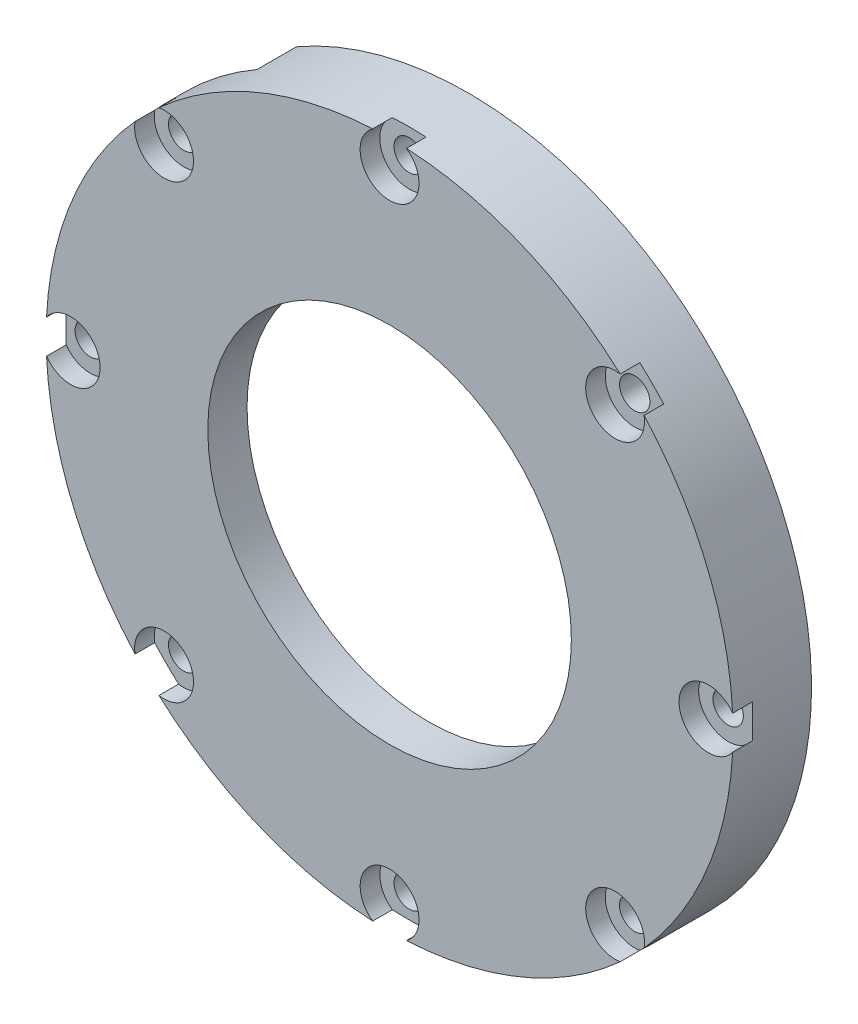
ISO-10303-21;
HEADER;
FILE_DESCRIPTION(('STEP AP214'),'2;1');
FILE_NAME('part.step','',(''),(''),'','','');
FILE_SCHEMA(('AUTOMOTIVE_DESIGN { 1 0 10303 214 1 1 1 1 }'));
ENDSEC;
DATA;
#1=APPLICATION_CONTEXT('core data for automotive mechanical design processes');
#2=APPLICATION_PROTOCOL_DEFINITION('international standard','automotive_design',2000,#1);
#3=PRODUCT_CONTEXT('',#1,'mechanical');
#4=PRODUCT('Part','Part','',(#3));
#5=PRODUCT_RELATED_PRODUCT_CATEGORY('part','',(#4));
#6=PRODUCT_DEFINITION_FORMATION('','',#4);
#7=PRODUCT_DEFINITION_CONTEXT('part definition',#1,'design');
#8=PRODUCT_DEFINITION('design','',#6,#7);
#9=PRODUCT_DEFINITION_SHAPE('','',#8);
#10=(LENGTH_UNIT() NAMED_UNIT(*) SI_UNIT(.MILLI.,.METRE.));
#11=(NAMED_UNIT(*) PLANE_ANGLE_UNIT() SI_UNIT($,.RADIAN.));
#12=(NAMED_UNIT(*) SI_UNIT($,.STERADIAN.) SOLID_ANGLE_UNIT());
#13=UNCERTAINTY_MEASURE_WITH_UNIT(LENGTH_MEASURE(1.E-05),#10,'distance_accuracy_value','');
#14=(GEOMETRIC_REPRESENTATION_CONTEXT(3) GLOBAL_UNCERTAINTY_ASSIGNED_CONTEXT((#13)) GLOBAL_UNIT_ASSIGNED_CONTEXT((#10,
#11,#12)) REPRESENTATION_CONTEXT('',''));
#15=CARTESIAN_POINT('',(0.,0.,0.));
#16=DIRECTION('',(0.,0.,1.));
#17=DIRECTION('',(1.,0.,0.));
#18=AXIS2_PLACEMENT_3D('',#15,#16,#17);
#19=CARTESIAN_POINT('',(-22.9809703885615,-22.9809703885641,2.));
#20=DIRECTION('',(0.,0.,1.));
#21=DIRECTION('',(1.,0.,0.));
#22=AXIS2_PLACEMENT_3D('',#19,#20,#21);
#23=CYLINDRICAL_SURFACE('',#22,1.55000000000094);
#24=CARTESIAN_POINT('',(-22.9809703885615,-22.9809703885641,2.));
#25=DIRECTION('',(0.,0.,1.));
#26=DIRECTION('',(1.,0.,0.));
#27=AXIS2_PLACEMENT_3D('',#24,#25,#26);
#28=CIRCLE('',#27,1.55000000000094);
#29=CARTESIAN_POINT('',(-21.4309703885606,-22.9809703885641,2.));
#30=VERTEX_POINT('',#29);
#31=EDGE_CURVE('E384',#30,#30,#28,.T.);
#32=ORIENTED_EDGE('',*,*,#31,.F.);
#33=EDGE_LOOP('',(#32));
#34=FACE_BOUND('',#33,.T.);
#35=CARTESIAN_POINT('',(-22.9809703885615,-22.9809703885641,8.));
#36=DIRECTION('',(0.,0.,1.));
#37=DIRECTION('',(1.,0.,0.));
#38=AXIS2_PLACEMENT_3D('',#35,#36,#37);
#39=CIRCLE('',#38,1.55000000000094);
#40=CARTESIAN_POINT('',(-21.4309703885606,-22.9809703885641,8.));
#41=VERTEX_POINT('',#40);
#42=EDGE_CURVE('E49',#41,#41,#39,.F.);
#43=ORIENTED_EDGE('',*,*,#42,.F.);
#44=EDGE_LOOP('',(#43));
#45=FACE_BOUND('',#44,.T.);
#46=ADVANCED_FACE('F45',(#34,#45),#23,.F.);
#47=CARTESIAN_POINT('',(22.9809703885641,-22.9809703885628,2.));
#48=DIRECTION('',(0.,0.,1.));
#49=DIRECTION('',(1.,0.,0.));
#50=AXIS2_PLACEMENT_3D('',#47,#48,#49);
#51=CYLINDRICAL_SURFACE('',#50,1.54999999999968);
#52=CARTESIAN_POINT('',(22.9809703885641,-22.9809703885628,2.));
#53=DIRECTION('',(0.,0.,1.));
#54=DIRECTION('',(1.,0.,0.));
#55=AXIS2_PLACEMENT_3D('',#52,#53,#54);
#56=CIRCLE('',#55,1.54999999999968);
#57=CARTESIAN_POINT('',(24.5309703885638,-22.9809703885628,2.));
#58=VERTEX_POINT('',#57);
#59=EDGE_CURVE('E380',#58,#58,#56,.T.);
#60=ORIENTED_EDGE('',*,*,#59,.F.);
#61=EDGE_LOOP('',(#60));
#62=FACE_BOUND('',#61,.T.);
#63=CARTESIAN_POINT('',(22.9809703885641,-22.9809703885628,8.));
#64=DIRECTION('',(0.,0.,1.));
#65=DIRECTION('',(1.,0.,0.));
#66=AXIS2_PLACEMENT_3D('',#63,#64,#65);
#67=CIRCLE('',#66,1.54999999999968);
#68=CARTESIAN_POINT('',(24.5309703885638,-22.9809703885628,8.));
#69=VERTEX_POINT('',#68);
#70=EDGE_CURVE('E416',#69,#69,#67,.F.);
#71=ORIENTED_EDGE('',*,*,#70,.F.);
#72=EDGE_LOOP('',(#71));
#73=FACE_BOUND('',#72,.T.);
#74=ADVANCED_FACE('F471',(#62,#73),#51,.F.);
#75=CARTESIAN_POINT('',(22.9809703885628,22.9809703885628,2.));
#76=DIRECTION('',(0.,0.,1.));
#77=DIRECTION('',(1.,0.,0.));
#78=AXIS2_PLACEMENT_3D('',#75,#76,#77);
#79=CYLINDRICAL_SURFACE('',#78,1.55);
#80=CARTESIAN_POINT('',(22.9809703885628,22.9809703885628,2.));
#81=DIRECTION('',(0.,0.,1.));
#82=DIRECTION('',(1.,0.,0.));
#83=AXIS2_PLACEMENT_3D('',#80,#81,#82);
#84=CIRCLE('',#83,1.55);
#85=CARTESIAN_POINT('',(24.5309703885628,22.9809703885628,2.));
#86=VERTEX_POINT('',#85);
#87=EDGE_CURVE('E208',#86,#86,#84,.T.);
#88=ORIENTED_EDGE('',*,*,#87,.F.);
#89=EDGE_LOOP('',(#88));
#90=FACE_BOUND('',#89,.T.);
#91=CARTESIAN_POINT('',(22.9809703885628,22.9809703885628,8.));
#92=DIRECTION('',(0.,0.,1.));
#93=DIRECTION('',(1.,0.,0.));
#94=AXIS2_PLACEMENT_3D('',#91,#92,#93);
#95=CIRCLE('',#94,1.55);
#96=CARTESIAN_POINT('',(24.5309703885628,22.9809703885628,8.));
#97=VERTEX_POINT('',#96);
#98=EDGE_CURVE('E420',#97,#97,#95,.F.);
#99=ORIENTED_EDGE('',*,*,#98,.F.);
#100=EDGE_LOOP('',(#99));
#101=FACE_BOUND('',#100,.T.);
#102=ADVANCED_FACE('F477',(#90,#101),#79,.F.);
#103=CARTESIAN_POINT('',(-22.9809703885629,22.9809703885615,2.));
#104=DIRECTION('',(0.,0.,1.));
#105=DIRECTION('',(1.,0.,0.));
#106=AXIS2_PLACEMENT_3D('',#103,#104,#105);
#107=CYLINDRICAL_SURFACE('',#106,1.55000000000137);
#108=CARTESIAN_POINT('',(-22.9809703885629,22.9809703885615,6.));
#109=DIRECTION('',(0.,0.,1.));
#110=DIRECTION('',(1.,0.,0.));
#111=AXIS2_PLACEMENT_3D('',#108,#109,#110);
#112=CIRCLE('',#111,1.55000000000137);
#113=CARTESIAN_POINT('',(-21.4309703885615,22.9809703885615,6.));
#114=VERTEX_POINT('',#113);
#115=EDGE_CURVE('E363',#114,#114,#112,.T.);
#116=ORIENTED_EDGE('',*,*,#115,.F.);
#117=EDGE_LOOP('',(#116));
#118=FACE_BOUND('',#117,.T.);
#119=CARTESIAN_POINT('',(-22.9809703885629,22.9809703885615,8.));
#120=DIRECTION('',(0.,0.,1.));
#121=DIRECTION('',(1.,0.,0.));
#122=AXIS2_PLACEMENT_3D('',#119,#120,#121);
#123=CIRCLE('',#122,1.55000000000137);
#124=CARTESIAN_POINT('',(-21.4309703885615,22.9809703885615,8.));
#125=VERTEX_POINT('',#124);
#126=EDGE_CURVE('E423',#125,#125,#123,.F.);
#127=ORIENTED_EDGE('',*,*,#126,.F.);
#128=EDGE_LOOP('',(#127));
#129=FACE_BOUND('',#128,.T.);
#130=ADVANCED_FACE('F488',(#118,#129),#107,.F.);
#131=CARTESIAN_POINT('',(0.,32.5,10.));
#132=DIRECTION('',(0.,0.,-1.));
#133=DIRECTION('',(-1.,0.,0.));
#134=AXIS2_PLACEMENT_3D('',#131,#132,#133);
#135=CYLINDRICAL_SURFACE('',#134,1.55);
#136=CARTESIAN_POINT('',(0.,32.5,2.));
#137=DIRECTION('',(0.,0.,-1.));
#138=DIRECTION('',(-1.,0.,0.));
#139=AXIS2_PLACEMENT_3D('',#136,#137,#138);
#140=CIRCLE('',#139,1.55);
#141=CARTESIAN_POINT('',(-1.55,32.5,2.));
#142=VERTEX_POINT('',#141);
#143=EDGE_CURVE('E284',#142,#142,#140,.T.);
#144=ORIENTED_EDGE('',*,*,#143,.T.);
#145=EDGE_LOOP('',(#144));
#146=FACE_BOUND('',#145,.T.);
#147=CARTESIAN_POINT('',(0.,32.5,8.));
#148=DIRECTION('',(0.,0.,1.));
#149=DIRECTION('',(1.,0.,0.));
#150=AXIS2_PLACEMENT_3D('',#147,#148,#149);
#151=CIRCLE('',#150,1.55);
#152=CARTESIAN_POINT('',(1.55,32.5,8.));
#153=VERTEX_POINT('',#152);
#154=EDGE_CURVE('E313',#153,#153,#151,.T.);
#155=ORIENTED_EDGE('',*,*,#154,.T.);
#156=EDGE_LOOP('',(#155));
#157=FACE_BOUND('',#156,.T.);
#158=ADVANCED_FACE('F492',(#146,#157),#135,.F.);
#159=CARTESIAN_POINT('',(32.5000000000009,9.17735403342287E-13,10.));
#160=DIRECTION('',(0.,0.,-1.));
#161=DIRECTION('',(-1.,0.,0.));
#162=AXIS2_PLACEMENT_3D('',#159,#160,#161);
#163=CYLINDRICAL_SURFACE('',#162,1.55000000000072);
#164=CARTESIAN_POINT('',(32.5000000000009,9.17735403342287E-13,2.));
#165=DIRECTION('',(0.,0.,-1.));
#166=DIRECTION('',(-1.,0.,0.));
#167=AXIS2_PLACEMENT_3D('',#164,#165,#166);
#168=CIRCLE('',#167,1.55000000000072);
#169=CARTESIAN_POINT('',(30.9500000000002,9.17735403342287E-13,2.));
#170=VERTEX_POINT('',#169);
#171=EDGE_CURVE('E288',#170,#170,#168,.T.);
#172=ORIENTED_EDGE('',*,*,#171,.T.);
#173=EDGE_LOOP('',(#172));
#174=FACE_BOUND('',#173,.T.);
#175=CARTESIAN_POINT('',(32.5000000000009,9.17735403342287E-13,8.));
#176=DIRECTION('',(0.,0.,1.));
#177=DIRECTION('',(1.,0.,0.));
#178=AXIS2_PLACEMENT_3D('',#175,#176,#177);
#179=CIRCLE('',#178,1.55000000000072);
#180=CARTESIAN_POINT('',(34.0500000000016,9.17735403342287E-13,8.));
#181=VERTEX_POINT('',#180);
#182=EDGE_CURVE('E317',#181,#181,#179,.T.);
#183=ORIENTED_EDGE('',*,*,#182,.T.);
#184=EDGE_LOOP('',(#183));
#185=FACE_BOUND('',#184,.T.);
#186=ADVANCED_FACE('F609',(#174,#185),#163,.F.);
#187=CARTESIAN_POINT('',(1.83547080668457E-12,-32.5,10.));
#188=DIRECTION('',(0.,0.,-1.));
#189=DIRECTION('',(-1.,0.,0.));
#190=AXIS2_PLACEMENT_3D('',#187,#188,#189);
#191=CYLINDRICAL_SURFACE('',#190,1.55000000000197);
#192=CARTESIAN_POINT('',(1.83547080668457E-12,-32.5,2.));
#193=DIRECTION('',(0.,0.,-1.));
#194=DIRECTION('',(-1.,0.,0.));
#195=AXIS2_PLACEMENT_3D('',#192,#193,#194);
#196=CIRCLE('',#195,1.55000000000197);
#197=CARTESIAN_POINT('',(-1.55000000000014,-32.5,2.));
#198=VERTEX_POINT('',#197);
#199=EDGE_CURVE('E292',#198,#198,#196,.T.);
#200=ORIENTED_EDGE('',*,*,#199,.T.);
#201=EDGE_LOOP('',(#200));
#202=FACE_BOUND('',#201,.T.);
#203=CARTESIAN_POINT('',(1.83547080668457E-12,-32.5,8.));
#204=DIRECTION('',(0.,0.,1.));
#205=DIRECTION('',(1.,0.,0.));
#206=AXIS2_PLACEMENT_3D('',#203,#204,#205);
#207=CIRCLE('',#206,1.55000000000197);
#208=CARTESIAN_POINT('',(1.55000000000381,-32.5,8.));
#209=VERTEX_POINT('',#208);
#210=EDGE_CURVE('E321',#209,#209,#207,.T.);
#211=ORIENTED_EDGE('',*,*,#210,.T.);
#212=EDGE_LOOP('',(#211));
#213=FACE_BOUND('',#212,.T.);
#214=ADVANCED_FACE('F605',(#202,#213),#191,.F.);
#215=CARTESIAN_POINT('',(-32.4999999999991,-9.21715505439516E-13,10.));
#216=DIRECTION('',(0.,0.,-1.));
#217=DIRECTION('',(-1.,0.,0.));
#218=AXIS2_PLACEMENT_3D('',#215,#216,#217);
#219=CYLINDRICAL_SURFACE('',#218,1.55000000000148);
#220=CARTESIAN_POINT('',(-32.4999999999991,-9.21715505439516E-13,2.));
#221=DIRECTION('',(0.,0.,-1.));
#222=DIRECTION('',(-1.,0.,0.));
#223=AXIS2_PLACEMENT_3D('',#220,#221,#222);
#224=CIRCLE('',#223,1.55000000000148);
#225=CARTESIAN_POINT('',(-34.0500000000006,-9.21715505439516E-13,2.));
#226=VERTEX_POINT('',#225);
#227=EDGE_CURVE('E296',#226,#226,#224,.T.);
#228=ORIENTED_EDGE('',*,*,#227,.T.);
#229=EDGE_LOOP('',(#228));
#230=FACE_BOUND('',#229,.T.);
#231=CARTESIAN_POINT('',(-32.4999999999991,-9.21715505439516E-13,8.));
#232=DIRECTION('',(0.,0.,1.));
#233=DIRECTION('',(1.,0.,0.));
#234=AXIS2_PLACEMENT_3D('',#231,#232,#233);
#235=CIRCLE('',#234,1.55000000000148);
#236=CARTESIAN_POINT('',(-30.9499999999976,-9.21715505439516E-13,8.));
#237=VERTEX_POINT('',#236);
#238=EDGE_CURVE('E325',#237,#237,#235,.T.);
#239=ORIENTED_EDGE('',*,*,#238,.T.);
#240=EDGE_LOOP('',(#239));
#241=FACE_BOUND('',#240,.T.);
#242=ADVANCED_FACE('F602',(#230,#241),#219,.F.);
#243=CARTESIAN_POINT('',(0.,0.,10.));
#244=DIRECTION('',(0.,0.,-1.));
#245=DIRECTION('',(-1.,0.,0.));
#246=AXIS2_PLACEMENT_3D('',#243,#244,#245);
#247=CYLINDRICAL_SURFACE('',#246,30.05);
#248=DIRECTION('',(0.,0.,-1.));
#249=VECTOR('',#248,1.);
#250=CARTESIAN_POINT('',(-15.025,26.0240633837224,6.));
#251=LINE('',#250,#249);
#252=CARTESIAN_POINT('',(-15.025,26.0240633837224,6.));
#253=VERTEX_POINT('',#252);
#254=CARTESIAN_POINT('',(-15.025,26.0240633837224,2.));
#255=VERTEX_POINT('',#254);
#256=EDGE_CURVE('E258',#253,#255,#251,.T.);
#257=ORIENTED_EDGE('',*,*,#256,.T.);
#258=CARTESIAN_POINT('',(0.,0.,2.));
#259=DIRECTION('',(0.,0.,-1.));
#260=DIRECTION('',(-1.,0.,0.));
#261=AXIS2_PLACEMENT_3D('',#258,#259,#260);
#262=CIRCLE('',#261,30.05);
#263=CARTESIAN_POINT('',(-26.0240633837224,15.0249999999999,2.));
#264=VERTEX_POINT('',#263);
#265=EDGE_CURVE('E306',#255,#264,#262,.T.);
#266=ORIENTED_EDGE('',*,*,#265,.T.);
#267=DIRECTION('',(0.,0.,-1.));
#268=VECTOR('',#267,1.);
#269=CARTESIAN_POINT('',(-26.0240633837224,15.0249999999999,6.));
#270=LINE('',#269,#268);
#271=CARTESIAN_POINT('',(-26.0240633837224,15.0249999999999,6.));
#272=VERTEX_POINT('',#271);
#273=EDGE_CURVE('E260',#272,#264,#270,.T.);
#274=ORIENTED_EDGE('',*,*,#273,.F.);
#275=CARTESIAN_POINT('',(0.,0.,6.));
#276=DIRECTION('',(0.,0.,1.));
#277=DIRECTION('',(1.,0.,0.));
#278=AXIS2_PLACEMENT_3D('',#275,#276,#277);
#279=CIRCLE('',#278,30.05);
#280=EDGE_CURVE('E240',#272,#253,#279,.T.);
#281=ORIENTED_EDGE('',*,*,#280,.T.);
#282=EDGE_LOOP('',(#257,#266,#274,#281));
#283=FACE_BOUND('',#282,.T.);
#284=ADVANCED_FACE('F575',(#283),#247,.F.);
#285=CARTESIAN_POINT('',(0.,0.,10.));
#286=DIRECTION('',(0.,0.,-1.));
#287=DIRECTION('',(-1.,0.,0.));
#288=AXIS2_PLACEMENT_3D('',#285,#286,#287);
#289=CYLINDRICAL_SURFACE('',#288,35.);
#290=CARTESIAN_POINT('',(0.,0.,8.));
#291=DIRECTION('',(0.,0.,1.));
#292=DIRECTION('',(1.,0.,0.));
#293=AXIS2_PLACEMENT_3D('',#290,#291,#292);
#294=CIRCLE('',#293,35.);
#295=CARTESIAN_POINT('',(-23.5023204591157,25.9353221116884,8.));
#296=VERTEX_POINT('',#295);
#297=CARTESIAN_POINT('',(-25.9353221116898,23.5023204591142,8.));
#298=VERTEX_POINT('',#297);
#299=EDGE_CURVE('E206',#296,#298,#294,.T.);
#300=ORIENTED_EDGE('',*,*,#299,.F.);
#301=DIRECTION('',(0.,0.,1.));
#302=VECTOR('',#301,1.);
#303=CARTESIAN_POINT('',(-23.5023204591157,25.9353221116884,9.));
#304=LINE('',#303,#302);
#305=CARTESIAN_POINT('',(-23.5023204591157,25.9353221116884,10.));
#306=VERTEX_POINT('',#305);
#307=EDGE_CURVE('E190',#296,#306,#304,.T.);
#308=ORIENTED_EDGE('',*,*,#307,.T.);
#309=CARTESIAN_POINT('',(0.,0.,10.));
#310=DIRECTION('',(0.,0.,1.));
#311=DIRECTION('',(1.,0.,0.));
#312=AXIS2_PLACEMENT_3D('',#309,#310,#311);
#313=CIRCLE('',#312,35.);
#314=CARTESIAN_POINT('',(-1.72039196717205,34.9576923076923,10.));
#315=VERTEX_POINT('',#314);
#316=EDGE_CURVE('E205',#315,#306,#313,.T.);
#317=ORIENTED_EDGE('',*,*,#316,.F.);
#318=DIRECTION('',(0.,0.,1.));
#319=VECTOR('',#318,1.);
#320=CARTESIAN_POINT('',(-1.72039196717204,34.9576923076923,9.));
#321=LINE('',#320,#319);
#322=CARTESIAN_POINT('',(-1.72039196717202,34.9576923076923,8.));
#323=VERTEX_POINT('',#322);
#324=EDGE_CURVE('E330',#315,#323,#321,.F.);
#325=ORIENTED_EDGE('',*,*,#324,.T.);
#326=CARTESIAN_POINT('',(0.,0.,8.));
#327=DIRECTION('',(0.,0.,1.));
#328=DIRECTION('',(1.,0.,0.));
#329=AXIS2_PLACEMENT_3D('',#326,#327,#328);
#330=CIRCLE('',#329,35.);
#331=CARTESIAN_POINT('',(1.72039196717202,34.9576923076923,8.));
#332=VERTEX_POINT('',#331);
#333=EDGE_CURVE('E310',#332,#323,#330,.T.);
#334=ORIENTED_EDGE('',*,*,#333,.F.);
#335=DIRECTION('',(0.,0.,1.));
#336=VECTOR('',#335,1.);
#337=CARTESIAN_POINT('',(1.72039196717204,34.9576923076923,9.));
#338=LINE('',#337,#336);
#339=CARTESIAN_POINT('',(1.72039196717204,34.9576923076923,10.));
#340=VERTEX_POINT('',#339);
#341=EDGE_CURVE('E326',#332,#340,#338,.T.);
#342=ORIENTED_EDGE('',*,*,#341,.T.);
#343=CARTESIAN_POINT('',(23.5023204591158,25.9353221116883,10.));
#344=VERTEX_POINT('',#343);
#345=EDGE_CURVE('E214',#344,#340,#313,.T.);
#346=ORIENTED_EDGE('',*,*,#345,.F.);
#347=DIRECTION('',(0.,0.,1.));
#348=VECTOR('',#347,1.);
#349=CARTESIAN_POINT('',(23.5023204591158,25.9353221116883,9.));
#350=LINE('',#349,#348);
#351=CARTESIAN_POINT('',(23.5023204591158,25.9353221116883,8.));
#352=VERTEX_POINT('',#351);
#353=EDGE_CURVE('E63',#344,#352,#350,.F.);
#354=ORIENTED_EDGE('',*,*,#353,.T.);
#355=CARTESIAN_POINT('',(0.,0.,8.));
#356=DIRECTION('',(0.,0.,1.));
#357=DIRECTION('',(1.,0.,0.));
#358=AXIS2_PLACEMENT_3D('',#355,#356,#357);
#359=CIRCLE('',#358,35.);
#360=CARTESIAN_POINT('',(25.9353221116882,23.5023204591159,8.));
#361=VERTEX_POINT('',#360);
#362=EDGE_CURVE('E417',#361,#352,#359,.T.);
#363=ORIENTED_EDGE('',*,*,#362,.F.);
#364=DIRECTION('',(0.,0.,1.));
#365=VECTOR('',#364,1.);
#366=CARTESIAN_POINT('',(25.9353221116882,23.5023204591159,9.));
#367=LINE('',#366,#365);
#368=CARTESIAN_POINT('',(25.9353221116882,23.5023204591159,10.));
#369=VERTEX_POINT('',#368);
#370=EDGE_CURVE('E404',#361,#369,#367,.T.);
#371=ORIENTED_EDGE('',*,*,#370,.T.);
#372=CARTESIAN_POINT('',(34.9576923076921,1.72039196717575,10.));
#373=VERTEX_POINT('',#372);
#374=EDGE_CURVE('E217',#373,#369,#313,.T.);
#375=ORIENTED_EDGE('',*,*,#374,.F.);
#376=DIRECTION('',(0.,0.,1.));
#377=VECTOR('',#376,1.);
#378=CARTESIAN_POINT('',(34.9576923076921,1.72039196717575,9.));
#379=LINE('',#378,#377);
#380=CARTESIAN_POINT('',(34.9576923076921,1.72039196717577,8.));
#381=VERTEX_POINT('',#380);
#382=EDGE_CURVE('E337',#373,#381,#379,.F.);
#383=ORIENTED_EDGE('',*,*,#382,.T.);
#384=CARTESIAN_POINT('',(0.,0.,8.));
#385=DIRECTION('',(0.,0.,1.));
#386=DIRECTION('',(1.,0.,0.));
#387=AXIS2_PLACEMENT_3D('',#384,#385,#386);
#388=CIRCLE('',#387,35.);
#389=CARTESIAN_POINT('',(34.9576923076922,-1.72039196717379,8.));
#390=VERTEX_POINT('',#389);
#391=EDGE_CURVE('E314',#390,#381,#388,.T.);
#392=ORIENTED_EDGE('',*,*,#391,.F.);
#393=DIRECTION('',(0.,0.,1.));
#394=VECTOR('',#393,1.);
#395=CARTESIAN_POINT('',(34.9576923076922,-1.72039196717378,9.));
#396=LINE('',#395,#394);
#397=CARTESIAN_POINT('',(34.9576923076922,-1.72039196717378,10.));
#398=VERTEX_POINT('',#397);
#399=EDGE_CURVE('E333',#390,#398,#396,.T.);
#400=ORIENTED_EDGE('',*,*,#399,.T.);
#401=CARTESIAN_POINT('',(25.9353221116894,-23.5023204591146,10.));
#402=VERTEX_POINT('',#401);
#403=EDGE_CURVE('E221',#402,#398,#313,.T.);
#404=ORIENTED_EDGE('',*,*,#403,.F.);
#405=DIRECTION('',(0.,0.,1.));
#406=VECTOR('',#405,1.);
#407=CARTESIAN_POINT('',(25.9353221116894,-23.5023204591146,9.));
#408=LINE('',#407,#406);
#409=CARTESIAN_POINT('',(25.9353221116895,-23.5023204591145,8.));
#410=VERTEX_POINT('',#409);
#411=EDGE_CURVE('E71',#402,#410,#408,.F.);
#412=ORIENTED_EDGE('',*,*,#411,.T.);
#413=CARTESIAN_POINT('',(0.,0.,8.));
#414=DIRECTION('',(0.,0.,1.));
#415=DIRECTION('',(1.,0.,0.));
#416=AXIS2_PLACEMENT_3D('',#413,#414,#415);
#417=CIRCLE('',#416,35.);
#418=CARTESIAN_POINT('',(23.502320459116,-25.9353221116881,8.));
#419=VERTEX_POINT('',#418);
#420=EDGE_CURVE('E413',#419,#410,#417,.T.);
#421=ORIENTED_EDGE('',*,*,#420,.F.);
#422=DIRECTION('',(0.,0.,1.));
#423=VECTOR('',#422,1.);
#424=CARTESIAN_POINT('',(23.5023204591161,-25.9353221116881,9.));
#425=LINE('',#424,#423);
#426=CARTESIAN_POINT('',(23.5023204591161,-25.9353221116881,10.));
#427=VERTEX_POINT('',#426);
#428=EDGE_CURVE('E398',#419,#427,#425,.T.);
#429=ORIENTED_EDGE('',*,*,#428,.T.);
#430=CARTESIAN_POINT('',(1.72039196717768,-34.957692307692,10.));
#431=VERTEX_POINT('',#430);
#432=EDGE_CURVE('E222',#431,#427,#313,.T.);
#433=ORIENTED_EDGE('',*,*,#432,.F.);
#434=DIRECTION('',(0.,0.,1.));
#435=VECTOR('',#434,1.);
#436=CARTESIAN_POINT('',(1.72039196717768,-34.957692307692,9.));
#437=LINE('',#436,#435);
#438=CARTESIAN_POINT('',(1.7203919671777,-34.957692307692,8.));
#439=VERTEX_POINT('',#438);
#440=EDGE_CURVE('E345',#431,#439,#437,.F.);
#441=ORIENTED_EDGE('',*,*,#440,.T.);
#442=CARTESIAN_POINT('',(0.,0.,8.));
#443=DIRECTION('',(0.,0.,1.));
#444=DIRECTION('',(1.,0.,0.));
#445=AXIS2_PLACEMENT_3D('',#442,#443,#444);
#446=CIRCLE('',#445,35.);
#447=CARTESIAN_POINT('',(-1.72039196717375,-34.9576923076922,8.));
#448=VERTEX_POINT('',#447);
#449=EDGE_CURVE('E318',#448,#439,#446,.T.);
#450=ORIENTED_EDGE('',*,*,#449,.F.);
#451=DIRECTION('',(0.,0.,1.));
#452=VECTOR('',#451,1.);
#453=CARTESIAN_POINT('',(-1.72039196717374,-34.9576923076922,9.));
#454=LINE('',#453,#452);
#455=CARTESIAN_POINT('',(-1.72039196717374,-34.9576923076922,10.));
#456=VERTEX_POINT('',#455);
#457=EDGE_CURVE('E341',#448,#456,#454,.T.);
#458=ORIENTED_EDGE('',*,*,#457,.T.);
#459=CARTESIAN_POINT('',(-23.5023204591131,-25.9353221116908,10.));
#460=VERTEX_POINT('',#459);
#461=EDGE_CURVE('E223',#460,#456,#313,.T.);
#462=ORIENTED_EDGE('',*,*,#461,.F.);
#463=DIRECTION('',(0.,0.,1.));
#464=VECTOR('',#463,1.);
#465=CARTESIAN_POINT('',(-23.5023204591131,-25.9353221116908,9.));
#466=LINE('',#465,#464);
#467=CARTESIAN_POINT('',(-23.5023204591131,-25.9353221116908,8.));
#468=VERTEX_POINT('',#467);
#469=EDGE_CURVE('E394',#460,#468,#466,.F.);
#470=ORIENTED_EDGE('',*,*,#469,.T.);
#471=CARTESIAN_POINT('',(0.,0.,8.));
#472=DIRECTION('',(0.,0.,1.));
#473=DIRECTION('',(1.,0.,0.));
#474=AXIS2_PLACEMENT_3D('',#471,#472,#473);
#475=CIRCLE('',#474,35.);
#476=CARTESIAN_POINT('',(-25.9353221116881,-23.502320459116,8.));
#477=VERTEX_POINT('',#476);
#478=EDGE_CURVE('E410',#477,#468,#475,.T.);
#479=ORIENTED_EDGE('',*,*,#478,.F.);
#480=DIRECTION('',(0.,0.,1.));
#481=VECTOR('',#480,1.);
#482=CARTESIAN_POINT('',(-25.9353221116881,-23.502320459116,9.));
#483=LINE('',#482,#481);
#484=CARTESIAN_POINT('',(-25.9353221116881,-23.502320459116,10.));
#485=VERTEX_POINT('',#484);
#486=EDGE_CURVE('E390',#477,#485,#483,.T.);
#487=ORIENTED_EDGE('',*,*,#486,.T.);
#488=CARTESIAN_POINT('',(-34.9576923076922,-1.7203919671743,10.));
#489=VERTEX_POINT('',#488);
#490=EDGE_CURVE('E218',#489,#485,#313,.T.);
#491=ORIENTED_EDGE('',*,*,#490,.F.);
#492=DIRECTION('',(0.,0.,1.));
#493=VECTOR('',#492,1.);
#494=CARTESIAN_POINT('',(-34.9576923076922,-1.72039196717432,9.));
#495=LINE('',#494,#493);
#496=CARTESIAN_POINT('',(-34.9576923076922,-1.72039196717437,8.));
#497=VERTEX_POINT('',#496);
#498=EDGE_CURVE('E353',#489,#497,#495,.F.);
#499=ORIENTED_EDGE('',*,*,#498,.T.);
#500=CARTESIAN_POINT('',(0.,0.,8.));
#501=DIRECTION('',(0.,0.,1.));
#502=DIRECTION('',(1.,0.,0.));
#503=AXIS2_PLACEMENT_3D('',#500,#501,#502);
#504=CIRCLE('',#503,35.);
#505=CARTESIAN_POINT('',(-34.9576923076923,1.72039196717239,8.));
#506=VERTEX_POINT('',#505);
#507=EDGE_CURVE('E322',#506,#497,#504,.T.);
#508=ORIENTED_EDGE('',*,*,#507,.F.);
#509=DIRECTION('',(0.,0.,1.));
#510=VECTOR('',#509,1.);
#511=CARTESIAN_POINT('',(-34.9576923076923,1.72039196717234,9.));
#512=LINE('',#511,#510);
#513=CARTESIAN_POINT('',(-34.9576923076923,1.72039196717234,10.));
#514=VERTEX_POINT('',#513);
#515=EDGE_CURVE('E349',#506,#514,#512,.T.);
#516=ORIENTED_EDGE('',*,*,#515,.T.);
#517=CARTESIAN_POINT('',(-25.9353221116897,23.5023204591142,10.));
#518=VERTEX_POINT('',#517);
#519=EDGE_CURVE('E215',#518,#514,#313,.T.);
#520=ORIENTED_EDGE('',*,*,#519,.F.);
#521=DIRECTION('',(0.,0.,1.));
#522=VECTOR('',#521,1.);
#523=CARTESIAN_POINT('',(-25.9353221116897,23.5023204591142,9.));
#524=LINE('',#523,#522);
#525=EDGE_CURVE('E193',#518,#298,#524,.F.);
#526=ORIENTED_EDGE('',*,*,#525,.T.);
#527=EDGE_LOOP('',(#300,#308,#317,#325,#334,#342,#346,#354,#363,#371,#375,#383,#392,#400,#404,
#412,#421,#429,#433,#441,#450,#458,#462,#470,#479,#487,#491,#499,#508,#516,#520,#526));
#528=FACE_BOUND('',#527,.T.);
#529=CARTESIAN_POINT('',(0.,0.,2.));
#530=DIRECTION('',(0.,0.,-1.));
#531=DIRECTION('',(-1.,0.,0.));
#532=AXIS2_PLACEMENT_3D('',#529,#530,#531);
#533=CIRCLE('',#532,35.);
#534=CARTESIAN_POINT('',(-17.5,30.3108891324554,2.));
#535=VERTEX_POINT('',#534);
#536=CARTESIAN_POINT('',(-30.3108891324554,17.4999999999999,2.));
#537=VERTEX_POINT('',#536);
#538=EDGE_CURVE('E303',#535,#537,#533,.T.);
#539=ORIENTED_EDGE('',*,*,#538,.F.);
#540=DIRECTION('',(0.,0.,-1.));
#541=VECTOR('',#540,1.);
#542=CARTESIAN_POINT('',(-17.5,30.3108891324553,6.));
#543=LINE('',#542,#541);
#544=CARTESIAN_POINT('',(-17.5,30.3108891324553,6.));
#545=VERTEX_POINT('',#544);
#546=EDGE_CURVE('E269',#545,#535,#543,.T.);
#547=ORIENTED_EDGE('',*,*,#546,.F.);
#548=CARTESIAN_POINT('',(0.,0.,6.));
#549=DIRECTION('',(0.,0.,-1.));
#550=DIRECTION('',(-1.,0.,0.));
#551=AXIS2_PLACEMENT_3D('',#548,#549,#550);
#552=CIRCLE('',#551,35.);
#553=CARTESIAN_POINT('',(-30.3108891324554,17.4999999999999,6.));
#554=VERTEX_POINT('',#553);
#555=EDGE_CURVE('E277',#554,#545,#552,.T.);
#556=ORIENTED_EDGE('',*,*,#555,.F.);
#557=DIRECTION('',(0.,0.,-1.));
#558=VECTOR('',#557,1.);
#559=CARTESIAN_POINT('',(-30.3108891324554,17.4999999999999,6.));
#560=LINE('',#559,#558);
#561=EDGE_CURVE('E264',#554,#537,#560,.T.);
#562=ORIENTED_EDGE('',*,*,#561,.T.);
#563=EDGE_LOOP('',(#539,#547,#556,#562));
#564=FACE_BOUND('',#563,.T.);
#565=ADVANCED_FACE('F47',(#528,#564),#289,.T.);
#566=CARTESIAN_POINT('',(-15.025,26.0240633837224,6.));
#567=DIRECTION('',(0.866025403784438,0.500000000000001,0.));
#568=DIRECTION('',(-0.500000000000001,0.866025403784438,0.));
#569=AXIS2_PLACEMENT_3D('',#566,#567,#568);
#570=PLANE('',#569);
#571=DIRECTION('',(-0.500000000000001,0.866025403784438,0.));
#572=VECTOR('',#571,1.);
#573=CARTESIAN_POINT('',(-15.025,26.0240633837224,2.));
#574=LINE('',#573,#572);
#575=EDGE_CURVE('E300',#255,#535,#574,.T.);
#576=ORIENTED_EDGE('',*,*,#575,.F.);
#577=ORIENTED_EDGE('',*,*,#256,.F.);
#578=DIRECTION('',(0.500000000000001,-0.866025403784438,0.));
#579=VECTOR('',#578,1.);
#580=CARTESIAN_POINT('',(-15.025,26.0240633837224,6.));
#581=LINE('',#580,#579);
#582=EDGE_CURVE('E265',#545,#253,#581,.T.);
#583=ORIENTED_EDGE('',*,*,#582,.F.);
#584=ORIENTED_EDGE('',*,*,#546,.T.);
#585=EDGE_LOOP('',(#576,#577,#583,#584));
#586=FACE_BOUND('',#585,.T.);
#587=ADVANCED_FACE('F584',(#586),#570,.F.);
#588=CARTESIAN_POINT('',(-26.0240633837224,15.0249999999999,6.));
#589=DIRECTION('',(-0.499999999999998,-0.86602540378444,0.));
#590=DIRECTION('',(0.86602540378444,-0.499999999999998,0.));
#591=AXIS2_PLACEMENT_3D('',#588,#589,#590);
#592=PLANE('',#591);
#593=DIRECTION('',(0.86602540378444,-0.499999999999998,0.));
#594=VECTOR('',#593,1.);
#595=CARTESIAN_POINT('',(-26.0240633837224,15.0249999999999,2.));
#596=LINE('',#595,#594);
#597=EDGE_CURVE('E228',#537,#264,#596,.T.);
#598=ORIENTED_EDGE('',*,*,#597,.F.);
#599=ORIENTED_EDGE('',*,*,#561,.F.);
#600=DIRECTION('',(-0.86602540378444,0.499999999999998,0.));
#601=VECTOR('',#600,1.);
#602=CARTESIAN_POINT('',(-26.0240633837224,15.0249999999999,6.));
#603=LINE('',#602,#601);
#604=EDGE_CURVE('E280',#272,#554,#603,.T.);
#605=ORIENTED_EDGE('',*,*,#604,.F.);
#606=ORIENTED_EDGE('',*,*,#273,.T.);
#607=EDGE_LOOP('',(#598,#599,#605,#606));
#608=FACE_BOUND('',#607,.T.);
#609=ADVANCED_FACE('F577',(#608),#592,.F.);
#610=CARTESIAN_POINT('',(0.,0.,10.));
#611=DIRECTION('',(0.,0.,1.));
#612=DIRECTION('',(1.,0.,0.));
#613=AXIS2_PLACEMENT_3D('',#610,#611,#612);
#614=PLANE('',#613);
#615=CARTESIAN_POINT('',(-22.9809703885628,22.9809703885615,10.));
#616=DIRECTION('',(0.,0.,1.));
#617=DIRECTION('',(1.,0.,0.));
#618=AXIS2_PLACEMENT_3D('',#615,#616,#617);
#619=CIRCLE('',#618,3.00000000000137);
#620=EDGE_CURVE('E186',#518,#306,#619,.T.);
#621=ORIENTED_EDGE('',*,*,#620,.F.);
#622=ORIENTED_EDGE('',*,*,#519,.T.);
#623=CARTESIAN_POINT('',(-32.4999999999991,-9.21715505439516E-13,10.));
#624=DIRECTION('',(0.,0.,1.));
#625=DIRECTION('',(1.,0.,0.));
#626=AXIS2_PLACEMENT_3D('',#623,#624,#625);
#627=CIRCLE('',#626,3.00000000000148);
#628=EDGE_CURVE('E565',#489,#514,#627,.T.);
#629=ORIENTED_EDGE('',*,*,#628,.F.);
#630=ORIENTED_EDGE('',*,*,#490,.T.);
#631=CARTESIAN_POINT('',(-22.9809703885615,-22.9809703885641,10.));
#632=DIRECTION('',(0.,0.,1.));
#633=DIRECTION('',(1.,0.,0.));
#634=AXIS2_PLACEMENT_3D('',#631,#632,#633);
#635=CIRCLE('',#634,3.00000000000094);
#636=EDGE_CURVE('E434',#460,#485,#635,.T.);
#637=ORIENTED_EDGE('',*,*,#636,.F.);
#638=ORIENTED_EDGE('',*,*,#461,.T.);
#639=CARTESIAN_POINT('',(1.83547080668457E-12,-32.5,10.));
#640=DIRECTION('',(0.,0.,1.));
#641=DIRECTION('',(1.,0.,0.));
#642=AXIS2_PLACEMENT_3D('',#639,#640,#641);
#643=CIRCLE('',#642,3.00000000000197);
#644=EDGE_CURVE('E55',#431,#456,#643,.T.);
#645=ORIENTED_EDGE('',*,*,#644,.F.);
#646=ORIENTED_EDGE('',*,*,#432,.T.);
#647=CARTESIAN_POINT('',(22.9809703885641,-22.9809703885628,10.));
#648=DIRECTION('',(0.,0.,1.));
#649=DIRECTION('',(1.,0.,0.));
#650=AXIS2_PLACEMENT_3D('',#647,#648,#649);
#651=CIRCLE('',#650,2.99999999999967);
#652=EDGE_CURVE('E441',#402,#427,#651,.T.);
#653=ORIENTED_EDGE('',*,*,#652,.F.);
#654=ORIENTED_EDGE('',*,*,#403,.T.);
#655=CARTESIAN_POINT('',(32.5000000000009,9.17735403342287E-13,10.));
#656=DIRECTION('',(0.,0.,1.));
#657=DIRECTION('',(1.,0.,0.));
#658=AXIS2_PLACEMENT_3D('',#655,#656,#657);
#659=CIRCLE('',#658,3.00000000000072);
#660=EDGE_CURVE('E367',#373,#398,#659,.T.);
#661=ORIENTED_EDGE('',*,*,#660,.F.);
#662=ORIENTED_EDGE('',*,*,#374,.T.);
#663=CARTESIAN_POINT('',(22.9809703885628,22.9809703885628,10.));
#664=DIRECTION('',(0.,0.,1.));
#665=DIRECTION('',(1.,0.,0.));
#666=AXIS2_PLACEMENT_3D('',#663,#664,#665);
#667=CIRCLE('',#666,3.);
#668=EDGE_CURVE('E424',#344,#369,#667,.T.);
#669=ORIENTED_EDGE('',*,*,#668,.F.);
#670=ORIENTED_EDGE('',*,*,#345,.T.);
#671=CARTESIAN_POINT('',(0.,32.5,10.));
#672=DIRECTION('',(0.,0.,1.));
#673=DIRECTION('',(1.,0.,0.));
#674=AXIS2_PLACEMENT_3D('',#671,#672,#673);
#675=CIRCLE('',#674,3.);
#676=EDGE_CURVE('E12',#315,#340,#675,.T.);
#677=ORIENTED_EDGE('',*,*,#676,.F.);
#678=ORIENTED_EDGE('',*,*,#316,.T.);
#679=EDGE_LOOP('',(#621,#622,#629,#630,#637,#638,#645,#646,#653,#654,#661,#662,#669,#670,#677,#678));
#680=FACE_BOUND('',#679,.T.);
#681=CARTESIAN_POINT('',(0.,0.,10.));
#682=DIRECTION('',(0.,0.,1.));
#683=DIRECTION('',(1.,0.,0.));
#684=AXIS2_PLACEMENT_3D('',#681,#682,#683);
#685=CIRCLE('',#684,18.525);
#686=CARTESIAN_POINT('',(18.525,0.,10.));
#687=VERTEX_POINT('',#686);
#688=EDGE_CURVE('E253',#687,#687,#685,.T.);
#689=ORIENTED_EDGE('',*,*,#688,.F.);
#690=EDGE_LOOP('',(#689));
#691=FACE_BOUND('',#690,.T.);
#692=ADVANCED_FACE('F211',(#680,#691),#614,.T.);
#693=CARTESIAN_POINT('',(0.,0.,6.));
#694=DIRECTION('',(0.,0.,1.));
#695=DIRECTION('',(1.,0.,0.));
#696=AXIS2_PLACEMENT_3D('',#693,#694,#695);
#697=PLANE('',#696);
#698=ORIENTED_EDGE('',*,*,#115,.T.);
#699=EDGE_LOOP('',(#698));
#700=FACE_BOUND('',#699,.T.);
#701=CARTESIAN_POINT('',(0.,0.,6.));
#702=DIRECTION('',(0.,0.,1.));
#703=DIRECTION('',(1.,0.,0.));
#704=AXIS2_PLACEMENT_3D('',#701,#702,#703);
#705=CIRCLE('',#704,18.525);
#706=CARTESIAN_POINT('',(18.525,0.,6.));
#707=VERTEX_POINT('',#706);
#708=EDGE_CURVE('E246',#707,#707,#705,.T.);
#709=ORIENTED_EDGE('',*,*,#708,.T.);
#710=EDGE_LOOP('',(#709));
#711=FACE_BOUND('',#710,.T.);
#712=ORIENTED_EDGE('',*,*,#280,.F.);
#713=ORIENTED_EDGE('',*,*,#604,.T.);
#714=ORIENTED_EDGE('',*,*,#555,.T.);
#715=ORIENTED_EDGE('',*,*,#582,.T.);
#716=EDGE_LOOP('',(#712,#713,#714,#715));
#717=FACE_BOUND('',#716,.T.);
#718=ADVANCED_FACE('F580',(#700,#711,#717),#697,.F.);
#719=CARTESIAN_POINT('',(0.,0.,6.));
#720=DIRECTION('',(0.,0.,1.));
#721=DIRECTION('',(1.,0.,0.));
#722=AXIS2_PLACEMENT_3D('',#719,#720,#721);
#723=CYLINDRICAL_SURFACE('',#722,18.525);
#724=ORIENTED_EDGE('',*,*,#708,.F.);
#725=EDGE_LOOP('',(#724));
#726=FACE_BOUND('',#725,.T.);
#727=ORIENTED_EDGE('',*,*,#688,.T.);
#728=EDGE_LOOP('',(#727));
#729=FACE_BOUND('',#728,.T.);
#730=ADVANCED_FACE('F595',(#726,#729),#723,.F.);
#731=CARTESIAN_POINT('',(0.,0.,2.));
#732=DIRECTION('',(0.,0.,-1.));
#733=DIRECTION('',(-1.,0.,0.));
#734=AXIS2_PLACEMENT_3D('',#731,#732,#733);
#735=PLANE('',#734);
#736=ORIENTED_EDGE('',*,*,#87,.T.);
#737=EDGE_LOOP('',(#736));
#738=FACE_BOUND('',#737,.T.);
#739=ORIENTED_EDGE('',*,*,#59,.T.);
#740=EDGE_LOOP('',(#739));
#741=FACE_BOUND('',#740,.T.);
#742=ORIENTED_EDGE('',*,*,#31,.T.);
#743=EDGE_LOOP('',(#742));
#744=FACE_BOUND('',#743,.T.);
#745=ORIENTED_EDGE('',*,*,#143,.F.);
#746=EDGE_LOOP('',(#745));
#747=FACE_BOUND('',#746,.T.);
#748=ORIENTED_EDGE('',*,*,#171,.F.);
#749=EDGE_LOOP('',(#748));
#750=FACE_BOUND('',#749,.T.);
#751=ORIENTED_EDGE('',*,*,#199,.F.);
#752=EDGE_LOOP('',(#751));
#753=FACE_BOUND('',#752,.T.);
#754=ORIENTED_EDGE('',*,*,#227,.F.);
#755=EDGE_LOOP('',(#754));
#756=FACE_BOUND('',#755,.T.);
#757=ORIENTED_EDGE('',*,*,#575,.T.);
#758=ORIENTED_EDGE('',*,*,#538,.T.);
#759=ORIENTED_EDGE('',*,*,#597,.T.);
#760=ORIENTED_EDGE('',*,*,#265,.F.);
#761=EDGE_LOOP('',(#757,#758,#759,#760));
#762=FACE_BOUND('',#761,.T.);
#763=ADVANCED_FACE('F571',(#738,#741,#744,#747,#750,#753,#756,#762),#735,.T.);
#764=CARTESIAN_POINT('',(-32.4999999999991,-9.21715505439516E-13,8.));
#765=DIRECTION('',(0.,0.,1.));
#766=DIRECTION('',(1.,0.,0.));
#767=AXIS2_PLACEMENT_3D('',#764,#765,#766);
#768=PLANE('',#767);
#769=ORIENTED_EDGE('',*,*,#238,.F.);
#770=EDGE_LOOP('',(#769));
#771=FACE_BOUND('',#770,.T.);
#772=ORIENTED_EDGE('',*,*,#507,.T.);
#773=CARTESIAN_POINT('',(-32.4999999999991,-9.21715505439516E-13,8.));
#774=DIRECTION('',(0.,0.,1.));
#775=DIRECTION('',(1.,0.,0.));
#776=AXIS2_PLACEMENT_3D('',#773,#774,#775);
#777=CIRCLE('',#776,3.00000000000148);
#778=EDGE_CURVE('E358',#497,#506,#777,.T.);
#779=ORIENTED_EDGE('',*,*,#778,.T.);
#780=EDGE_LOOP('',(#772,#779));
#781=FACE_BOUND('',#780,.T.);
#782=ADVANCED_FACE('F640',(#771,#781),#768,.T.);
#783=CARTESIAN_POINT('',(-32.4999999999991,-9.21715505439516E-13,8.));
#784=DIRECTION('',(0.,0.,1.));
#785=DIRECTION('',(1.,0.,0.));
#786=AXIS2_PLACEMENT_3D('',#783,#784,#785);
#787=CYLINDRICAL_SURFACE('',#786,3.00000000000148);
#788=ORIENTED_EDGE('',*,*,#778,.F.);
#789=ORIENTED_EDGE('',*,*,#498,.F.);
#790=ORIENTED_EDGE('',*,*,#628,.T.);
#791=ORIENTED_EDGE('',*,*,#515,.F.);
#792=EDGE_LOOP('',(#788,#789,#790,#791));
#793=FACE_BOUND('',#792,.T.);
#794=ADVANCED_FACE('F647',(#793),#787,.F.);
#795=CARTESIAN_POINT('',(1.83547080668457E-12,-32.5,8.));
#796=DIRECTION('',(0.,0.,1.));
#797=DIRECTION('',(1.,0.,0.));
#798=AXIS2_PLACEMENT_3D('',#795,#796,#797);
#799=PLANE('',#798);
#800=ORIENTED_EDGE('',*,*,#210,.F.);
#801=EDGE_LOOP('',(#800));
#802=FACE_BOUND('',#801,.T.);
#803=ORIENTED_EDGE('',*,*,#449,.T.);
#804=CARTESIAN_POINT('',(1.83547080668457E-12,-32.5,8.));
#805=DIRECTION('',(0.,0.,1.));
#806=DIRECTION('',(1.,0.,0.));
#807=AXIS2_PLACEMENT_3D('',#804,#805,#806);
#808=CIRCLE('',#807,3.00000000000197);
#809=EDGE_CURVE('E362',#439,#448,#808,.T.);
#810=ORIENTED_EDGE('',*,*,#809,.T.);
#811=EDGE_LOOP('',(#803,#810));
#812=FACE_BOUND('',#811,.T.);
#813=ADVANCED_FACE('F465',(#802,#812),#799,.T.);
#814=CARTESIAN_POINT('',(1.83547080668457E-12,-32.5,8.));
#815=DIRECTION('',(0.,0.,1.));
#816=DIRECTION('',(1.,0.,0.));
#817=AXIS2_PLACEMENT_3D('',#814,#815,#816);
#818=CYLINDRICAL_SURFACE('',#817,3.00000000000197);
#819=ORIENTED_EDGE('',*,*,#809,.F.);
#820=ORIENTED_EDGE('',*,*,#440,.F.);
#821=ORIENTED_EDGE('',*,*,#644,.T.);
#822=ORIENTED_EDGE('',*,*,#457,.F.);
#823=EDGE_LOOP('',(#819,#820,#821,#822));
#824=FACE_BOUND('',#823,.T.);
#825=ADVANCED_FACE('F456',(#824),#818,.F.);
#826=CARTESIAN_POINT('',(32.5000000000009,9.17735403342287E-13,8.));
#827=DIRECTION('',(0.,0.,1.));
#828=DIRECTION('',(1.,0.,0.));
#829=AXIS2_PLACEMENT_3D('',#826,#827,#828);
#830=PLANE('',#829);
#831=ORIENTED_EDGE('',*,*,#182,.F.);
#832=EDGE_LOOP('',(#831));
#833=FACE_BOUND('',#832,.T.);
#834=ORIENTED_EDGE('',*,*,#391,.T.);
#835=CARTESIAN_POINT('',(32.5000000000009,9.17735403342287E-13,8.));
#836=DIRECTION('',(0.,0.,1.));
#837=DIRECTION('',(1.,0.,0.));
#838=AXIS2_PLACEMENT_3D('',#835,#836,#837);
#839=CIRCLE('',#838,3.00000000000072);
#840=EDGE_CURVE('E370',#381,#390,#839,.T.);
#841=ORIENTED_EDGE('',*,*,#840,.T.);
#842=EDGE_LOOP('',(#834,#841));
#843=FACE_BOUND('',#842,.T.);
#844=ADVANCED_FACE('F454',(#833,#843),#830,.T.);
#845=CARTESIAN_POINT('',(32.5000000000009,9.17735403342287E-13,8.));
#846=DIRECTION('',(0.,0.,1.));
#847=DIRECTION('',(1.,0.,0.));
#848=AXIS2_PLACEMENT_3D('',#845,#846,#847);
#849=CYLINDRICAL_SURFACE('',#848,3.00000000000072);
#850=ORIENTED_EDGE('',*,*,#840,.F.);
#851=ORIENTED_EDGE('',*,*,#382,.F.);
#852=ORIENTED_EDGE('',*,*,#660,.T.);
#853=ORIENTED_EDGE('',*,*,#399,.F.);
#854=EDGE_LOOP('',(#850,#851,#852,#853));
#855=FACE_BOUND('',#854,.T.);
#856=ADVANCED_FACE('F452',(#855),#849,.F.);
#857=CARTESIAN_POINT('',(0.,32.5,8.));
#858=DIRECTION('',(0.,0.,1.));
#859=DIRECTION('',(1.,0.,0.));
#860=AXIS2_PLACEMENT_3D('',#857,#858,#859);
#861=PLANE('',#860);
#862=ORIENTED_EDGE('',*,*,#154,.F.);
#863=EDGE_LOOP('',(#862));
#864=FACE_BOUND('',#863,.T.);
#865=ORIENTED_EDGE('',*,*,#333,.T.);
#866=CARTESIAN_POINT('',(0.,32.5,8.));
#867=DIRECTION('',(0.,0.,1.));
#868=DIRECTION('',(1.,0.,0.));
#869=AXIS2_PLACEMENT_3D('',#866,#867,#868);
#870=CIRCLE('',#869,3.);
#871=EDGE_CURVE('E357',#323,#332,#870,.T.);
#872=ORIENTED_EDGE('',*,*,#871,.T.);
#873=EDGE_LOOP('',(#865,#872));
#874=FACE_BOUND('',#873,.T.);
#875=ADVANCED_FACE('F463',(#864,#874),#861,.T.);
#876=CARTESIAN_POINT('',(0.,32.5,8.));
#877=DIRECTION('',(0.,0.,1.));
#878=DIRECTION('',(1.,0.,0.));
#879=AXIS2_PLACEMENT_3D('',#876,#877,#878);
#880=CYLINDRICAL_SURFACE('',#879,3.);
#881=ORIENTED_EDGE('',*,*,#871,.F.);
#882=ORIENTED_EDGE('',*,*,#324,.F.);
#883=ORIENTED_EDGE('',*,*,#676,.T.);
#884=ORIENTED_EDGE('',*,*,#341,.F.);
#885=EDGE_LOOP('',(#881,#882,#883,#884));
#886=FACE_BOUND('',#885,.T.);
#887=ADVANCED_FACE('F495',(#886),#880,.F.);
#888=CARTESIAN_POINT('',(-22.9809703885628,22.9809703885615,8.));
#889=DIRECTION('',(0.,0.,1.));
#890=DIRECTION('',(1.,0.,0.));
#891=AXIS2_PLACEMENT_3D('',#888,#889,#890);
#892=CYLINDRICAL_SURFACE('',#891,3.00000000000137);
#893=CARTESIAN_POINT('',(-22.9809703885628,22.9809703885615,8.));
#894=DIRECTION('',(0.,0.,1.));
#895=DIRECTION('',(1.,0.,0.));
#896=AXIS2_PLACEMENT_3D('',#893,#894,#895);
#897=CIRCLE('',#896,3.00000000000137);
#898=EDGE_CURVE('E198',#298,#296,#897,.T.);
#899=ORIENTED_EDGE('',*,*,#898,.F.);
#900=ORIENTED_EDGE('',*,*,#525,.F.);
#901=ORIENTED_EDGE('',*,*,#620,.T.);
#902=ORIENTED_EDGE('',*,*,#307,.F.);
#903=EDGE_LOOP('',(#899,#900,#901,#902));
#904=FACE_BOUND('',#903,.T.);
#905=ADVANCED_FACE('F189',(#904),#892,.F.);
#906=CARTESIAN_POINT('',(-22.9809703885628,22.9809703885615,8.));
#907=DIRECTION('',(0.,0.,1.));
#908=DIRECTION('',(1.,0.,0.));
#909=AXIS2_PLACEMENT_3D('',#906,#907,#908);
#910=PLANE('',#909);
#911=ORIENTED_EDGE('',*,*,#126,.T.);
#912=EDGE_LOOP('',(#911));
#913=FACE_BOUND('',#912,.T.);
#914=ORIENTED_EDGE('',*,*,#299,.T.);
#915=ORIENTED_EDGE('',*,*,#898,.T.);
#916=EDGE_LOOP('',(#914,#915));
#917=FACE_BOUND('',#916,.T.);
#918=ADVANCED_FACE('F502',(#913,#917),#910,.T.);
#919=CARTESIAN_POINT('',(22.9809703885628,22.9809703885628,8.));
#920=DIRECTION('',(0.,0.,1.));
#921=DIRECTION('',(1.,0.,0.));
#922=AXIS2_PLACEMENT_3D('',#919,#920,#921);
#923=CYLINDRICAL_SURFACE('',#922,3.);
#924=CARTESIAN_POINT('',(22.9809703885628,22.9809703885628,8.));
#925=DIRECTION('',(0.,0.,1.));
#926=DIRECTION('',(1.,0.,0.));
#927=AXIS2_PLACEMENT_3D('',#924,#925,#926);
#928=CIRCLE('',#927,3.);
#929=EDGE_CURVE('E427',#352,#361,#928,.T.);
#930=ORIENTED_EDGE('',*,*,#929,.F.);
#931=ORIENTED_EDGE('',*,*,#353,.F.);
#932=ORIENTED_EDGE('',*,*,#668,.T.);
#933=ORIENTED_EDGE('',*,*,#370,.F.);
#934=EDGE_LOOP('',(#930,#931,#932,#933));
#935=FACE_BOUND('',#934,.T.);
#936=ADVANCED_FACE('F483',(#935),#923,.F.);
#937=CARTESIAN_POINT('',(22.9809703885628,22.9809703885628,8.));
#938=DIRECTION('',(0.,0.,1.));
#939=DIRECTION('',(1.,0.,0.));
#940=AXIS2_PLACEMENT_3D('',#937,#938,#939);
#941=PLANE('',#940);
#942=ORIENTED_EDGE('',*,*,#98,.T.);
#943=EDGE_LOOP('',(#942));
#944=FACE_BOUND('',#943,.T.);
#945=ORIENTED_EDGE('',*,*,#362,.T.);
#946=ORIENTED_EDGE('',*,*,#929,.T.);
#947=EDGE_LOOP('',(#945,#946));
#948=FACE_BOUND('',#947,.T.);
#949=ADVANCED_FACE('F511',(#944,#948),#941,.T.);
#950=CARTESIAN_POINT('',(22.9809703885641,-22.9809703885628,8.));
#951=DIRECTION('',(0.,0.,1.));
#952=DIRECTION('',(1.,0.,0.));
#953=AXIS2_PLACEMENT_3D('',#950,#951,#952);
#954=CYLINDRICAL_SURFACE('',#953,2.99999999999967);
#955=CARTESIAN_POINT('',(22.9809703885641,-22.9809703885628,8.));
#956=DIRECTION('',(0.,0.,1.));
#957=DIRECTION('',(1.,0.,0.));
#958=AXIS2_PLACEMENT_3D('',#955,#956,#957);
#959=CIRCLE('',#958,2.99999999999967);
#960=EDGE_CURVE('E428',#410,#419,#959,.T.);
#961=ORIENTED_EDGE('',*,*,#960,.F.);
#962=ORIENTED_EDGE('',*,*,#411,.F.);
#963=ORIENTED_EDGE('',*,*,#652,.T.);
#964=ORIENTED_EDGE('',*,*,#428,.F.);
#965=EDGE_LOOP('',(#961,#962,#963,#964));
#966=FACE_BOUND('',#965,.T.);
#967=ADVANCED_FACE('F513',(#966),#954,.F.);
#968=CARTESIAN_POINT('',(22.9809703885641,-22.9809703885628,8.));
#969=DIRECTION('',(0.,0.,1.));
#970=DIRECTION('',(1.,0.,0.));
#971=AXIS2_PLACEMENT_3D('',#968,#969,#970);
#972=PLANE('',#971);
#973=ORIENTED_EDGE('',*,*,#70,.T.);
#974=EDGE_LOOP('',(#973));
#975=FACE_BOUND('',#974,.T.);
#976=ORIENTED_EDGE('',*,*,#420,.T.);
#977=ORIENTED_EDGE('',*,*,#960,.T.);
#978=EDGE_LOOP('',(#976,#977));
#979=FACE_BOUND('',#978,.T.);
#980=ADVANCED_FACE('F448',(#975,#979),#972,.T.);
#981=CARTESIAN_POINT('',(-22.9809703885615,-22.9809703885641,8.));
#982=DIRECTION('',(0.,0.,1.));
#983=DIRECTION('',(1.,0.,0.));
#984=AXIS2_PLACEMENT_3D('',#981,#982,#983);
#985=CYLINDRICAL_SURFACE('',#984,3.00000000000094);
#986=CARTESIAN_POINT('',(-22.9809703885615,-22.9809703885641,8.));
#987=DIRECTION('',(0.,0.,1.));
#988=DIRECTION('',(1.,0.,0.));
#989=AXIS2_PLACEMENT_3D('',#986,#987,#988);
#990=CIRCLE('',#989,3.00000000000094);
#991=EDGE_CURVE('E437',#468,#477,#990,.T.);
#992=ORIENTED_EDGE('',*,*,#991,.F.);
#993=ORIENTED_EDGE('',*,*,#469,.F.);
#994=ORIENTED_EDGE('',*,*,#636,.T.);
#995=ORIENTED_EDGE('',*,*,#486,.F.);
#996=EDGE_LOOP('',(#992,#993,#994,#995));
#997=FACE_BOUND('',#996,.T.);
#998=ADVANCED_FACE('F525',(#997),#985,.F.);
#999=CARTESIAN_POINT('',(-22.9809703885615,-22.9809703885641,8.));
#1000=DIRECTION('',(0.,0.,1.));
#1001=DIRECTION('',(1.,0.,0.));
#1002=AXIS2_PLACEMENT_3D('',#999,#1000,#1001);
#1003=PLANE('',#1002);
#1004=ORIENTED_EDGE('',*,*,#42,.T.);
#1005=EDGE_LOOP('',(#1004));
#1006=FACE_BOUND('',#1005,.T.);
#1007=ORIENTED_EDGE('',*,*,#478,.T.);
#1008=ORIENTED_EDGE('',*,*,#991,.T.);
#1009=EDGE_LOOP('',(#1007,#1008));
#1010=FACE_BOUND('',#1009,.T.);
#1011=ADVANCED_FACE('F528',(#1006,#1010),#1003,.T.);
#1012=CLOSED_SHELL('',(#46,#74,#102,#130,#158,#186,#214,#242,#284,#565,#587,#609,#692,#718,#730,
#763,#782,#794,#813,#825,#844,#856,#875,#887,#905,#918,#936,#949,#967,#980,#998,#1011));
#1013=MANIFOLD_SOLID_BREP('B2',#1012);
#1014=ADVANCED_BREP_SHAPE_REPRESENTATION('',(#18,#1013),#14);
#1015=SHAPE_DEFINITION_REPRESENTATION(#9,#1014);
ENDSEC;
END-ISO-10303-21;
